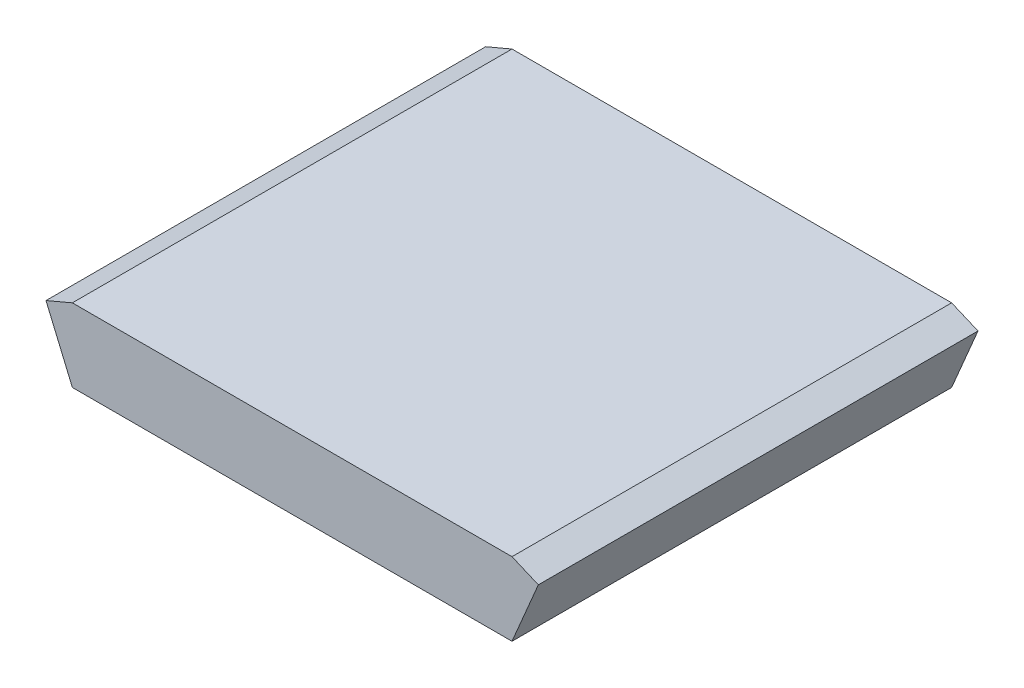
ISO-10303-21;
HEADER;
FILE_DESCRIPTION(('STEP AP214'),'2;1');
FILE_NAME('part.step','',(''),(''),'','','');
FILE_SCHEMA(('AUTOMOTIVE_DESIGN { 1 0 10303 214 1 1 1 1 }'));
ENDSEC;
DATA;
#1=APPLICATION_CONTEXT('core data for automotive mechanical design processes');
#2=APPLICATION_PROTOCOL_DEFINITION('international standard','automotive_design',2000,#1);
#3=PRODUCT_CONTEXT('',#1,'mechanical');
#4=PRODUCT('Part','Part','',(#3));
#5=PRODUCT_RELATED_PRODUCT_CATEGORY('part','',(#4));
#6=PRODUCT_DEFINITION_FORMATION('','',#4);
#7=PRODUCT_DEFINITION_CONTEXT('part definition',#1,'design');
#8=PRODUCT_DEFINITION('design','',#6,#7);
#9=PRODUCT_DEFINITION_SHAPE('','',#8);
#10=(LENGTH_UNIT() NAMED_UNIT(*) SI_UNIT(.MILLI.,.METRE.));
#11=(NAMED_UNIT(*) PLANE_ANGLE_UNIT() SI_UNIT($,.RADIAN.));
#12=(NAMED_UNIT(*) SI_UNIT($,.STERADIAN.) SOLID_ANGLE_UNIT());
#13=UNCERTAINTY_MEASURE_WITH_UNIT(LENGTH_MEASURE(1.E-05),#10,'distance_accuracy_value','');
#14=(GEOMETRIC_REPRESENTATION_CONTEXT(3) GLOBAL_UNCERTAINTY_ASSIGNED_CONTEXT((#13)) GLOBAL_UNIT_ASSIGNED_CONTEXT((#10,
#11,#12)) REPRESENTATION_CONTEXT('',''));
#15=CARTESIAN_POINT('',(0.,0.,0.));
#16=DIRECTION('',(0.,0.,1.));
#17=DIRECTION('',(1.,0.,0.));
#18=AXIS2_PLACEMENT_3D('',#15,#16,#17);
#19=CARTESIAN_POINT('',(-0.318923697198086,0.751337146561365,-1.5));
#20=DIRECTION('',(0.390731128489275,-0.920504853452439,0.));
#21=DIRECTION('',(0.92050485345244,0.390731128489275,0.));
#22=AXIS2_PLACEMENT_3D('',#19,#20,#21);
#23=PLANE('',#22);
#24=DIRECTION('',(0.,0.,1.));
#25=VECTOR('',#24,1.);
#26=CARTESIAN_POINT('',(-1.67983495008466,0.173664592614749,-1.5));
#27=LINE('',#26,#25);
#28=CARTESIAN_POINT('',(-1.67983495008466,0.173664592614749,-1.5));
#29=VERTEX_POINT('',#28);
#30=CARTESIAN_POINT('',(-1.67983495008466,0.173664592614749,1.5));
#31=VERTEX_POINT('',#30);
#32=EDGE_CURVE('E35',#29,#31,#27,.T.);
#33=ORIENTED_EDGE('',*,*,#32,.T.);
#34=DIRECTION('',(0.92050485345244,0.390731128489275,0.));
#35=VECTOR('',#34,1.);
#36=CARTESIAN_POINT('',(-0.318923697198086,0.751337146561365,1.5));
#37=LINE('',#36,#35);
#38=CARTESIAN_POINT('',(-1.5,0.25,1.5));
#39=VERTEX_POINT('',#38);
#40=EDGE_CURVE('E86',#31,#39,#37,.T.);
#41=ORIENTED_EDGE('',*,*,#40,.T.);
#42=DIRECTION('',(0.,0.,1.));
#43=VECTOR('',#42,1.);
#44=CARTESIAN_POINT('',(-1.5,0.25,-1.5));
#45=LINE('',#44,#43);
#46=CARTESIAN_POINT('',(-1.5,0.25,-1.5));
#47=VERTEX_POINT('',#46);
#48=EDGE_CURVE('E11',#47,#39,#45,.T.);
#49=ORIENTED_EDGE('',*,*,#48,.F.);
#50=DIRECTION('',(0.92050485345244,0.390731128489275,0.));
#51=VECTOR('',#50,1.);
#52=CARTESIAN_POINT('',(-0.318923697198086,0.751337146561365,-1.5));
#53=LINE('',#52,#51);
#54=EDGE_CURVE('E88',#29,#47,#53,.T.);
#55=ORIENTED_EDGE('',*,*,#54,.F.);
#56=EDGE_LOOP('',(#33,#41,#49,#55));
#57=FACE_BOUND('',#56,.T.);
#58=ADVANCED_FACE('F32',(#57),#23,.F.);
#59=CARTESIAN_POINT('',(0.,0.25,-1.5));
#60=DIRECTION('',(0.,-1.,0.));
#61=DIRECTION('',(1.,0.,0.));
#62=AXIS2_PLACEMENT_3D('',#59,#60,#61);
#63=PLANE('',#62);
#64=ORIENTED_EDGE('',*,*,#48,.T.);
#65=DIRECTION('',(1.,0.,0.));
#66=VECTOR('',#65,1.);
#67=CARTESIAN_POINT('',(0.,0.25,1.5));
#68=LINE('',#67,#66);
#69=CARTESIAN_POINT('',(1.5,0.25,1.5));
#70=VERTEX_POINT('',#69);
#71=EDGE_CURVE('E100',#39,#70,#68,.T.);
#72=ORIENTED_EDGE('',*,*,#71,.T.);
#73=DIRECTION('',(0.,0.,1.));
#74=VECTOR('',#73,1.);
#75=CARTESIAN_POINT('',(1.5,0.25,-1.5));
#76=LINE('',#75,#74);
#77=CARTESIAN_POINT('',(1.5,0.25,-1.5));
#78=VERTEX_POINT('',#77);
#79=EDGE_CURVE('E40',#78,#70,#76,.T.);
#80=ORIENTED_EDGE('',*,*,#79,.F.);
#81=DIRECTION('',(1.,0.,0.));
#82=VECTOR('',#81,1.);
#83=CARTESIAN_POINT('',(0.,0.25,-1.5));
#84=LINE('',#83,#82);
#85=EDGE_CURVE('E47',#47,#78,#84,.T.);
#86=ORIENTED_EDGE('',*,*,#85,.F.);
#87=EDGE_LOOP('',(#64,#72,#80,#86));
#88=FACE_BOUND('',#87,.T.);
#89=ADVANCED_FACE('F142',(#88),#63,.F.);
#90=CARTESIAN_POINT('',(0.318923697198081,0.751337146561361,-1.5));
#91=DIRECTION('',(0.390731128489272,0.920504853452441,0.));
#92=DIRECTION('',(-0.920504853452441,0.390731128489272,0.));
#93=AXIS2_PLACEMENT_3D('',#90,#91,#92);
#94=PLANE('',#93);
#95=ORIENTED_EDGE('',*,*,#79,.T.);
#96=DIRECTION('',(-0.920504853452441,0.390731128489272,0.));
#97=VECTOR('',#96,1.);
#98=CARTESIAN_POINT('',(0.318923697198081,0.751337146561361,1.5));
#99=LINE('',#98,#97);
#100=CARTESIAN_POINT('',(1.67983495008466,0.173664592614749,1.5));
#101=VERTEX_POINT('',#100);
#102=EDGE_CURVE('E111',#101,#70,#99,.T.);
#103=ORIENTED_EDGE('',*,*,#102,.F.);
#104=DIRECTION('',(0.,0.,1.));
#105=VECTOR('',#104,1.);
#106=CARTESIAN_POINT('',(1.67983495008466,0.173664592614749,-1.5));
#107=LINE('',#106,#105);
#108=CARTESIAN_POINT('',(1.67983495008466,0.173664592614749,-1.5));
#109=VERTEX_POINT('',#108);
#110=EDGE_CURVE('E128',#109,#101,#107,.T.);
#111=ORIENTED_EDGE('',*,*,#110,.F.);
#112=DIRECTION('',(-0.920504853452441,0.390731128489272,0.));
#113=VECTOR('',#112,1.);
#114=CARTESIAN_POINT('',(0.318923697198081,0.751337146561361,-1.5));
#115=LINE('',#114,#113);
#116=EDGE_CURVE('E123',#109,#78,#115,.T.);
#117=ORIENTED_EDGE('',*,*,#116,.T.);
#118=EDGE_LOOP('',(#95,#103,#111,#117));
#119=FACE_BOUND('',#118,.T.);
#120=ADVANCED_FACE('F140',(#119),#94,.T.);
#121=CARTESIAN_POINT('',(1.36091125288658,-0.577672553946618,-1.5));
#122=DIRECTION('',(0.920504853452439,-0.390731128489277,0.));
#123=DIRECTION('',(0.390731128489277,0.920504853452439,0.));
#124=AXIS2_PLACEMENT_3D('',#121,#122,#123);
#125=PLANE('',#124);
#126=ORIENTED_EDGE('',*,*,#110,.T.);
#127=DIRECTION('',(0.390731128489277,0.920504853452439,0.));
#128=VECTOR('',#127,1.);
#129=CARTESIAN_POINT('',(1.36091125288658,-0.577672553946618,1.5));
#130=LINE('',#129,#128);
#131=CARTESIAN_POINT('',(1.5,-0.249999999999999,1.5));
#132=VERTEX_POINT('',#131);
#133=EDGE_CURVE('E106',#132,#101,#130,.T.);
#134=ORIENTED_EDGE('',*,*,#133,.F.);
#135=DIRECTION('',(0.,0.,1.));
#136=VECTOR('',#135,1.);
#137=CARTESIAN_POINT('',(1.5,-0.249999999999999,-1.5));
#138=LINE('',#137,#136);
#139=CARTESIAN_POINT('',(1.5,-0.249999999999999,-1.5));
#140=VERTEX_POINT('',#139);
#141=EDGE_CURVE('E130',#140,#132,#138,.T.);
#142=ORIENTED_EDGE('',*,*,#141,.F.);
#143=DIRECTION('',(0.390731128489277,0.920504853452439,0.));
#144=VECTOR('',#143,1.);
#145=CARTESIAN_POINT('',(1.36091125288658,-0.577672553946618,-1.5));
#146=LINE('',#145,#144);
#147=EDGE_CURVE('E120',#140,#109,#146,.T.);
#148=ORIENTED_EDGE('',*,*,#147,.T.);
#149=EDGE_LOOP('',(#126,#134,#142,#148));
#150=FACE_BOUND('',#149,.T.);
#151=ADVANCED_FACE('F138',(#150),#125,.T.);
#152=CARTESIAN_POINT('',(0.,-0.25,-1.5));
#153=DIRECTION('',(0.,-1.,0.));
#154=DIRECTION('',(1.,0.,0.));
#155=AXIS2_PLACEMENT_3D('',#152,#153,#154);
#156=PLANE('',#155);
#157=ORIENTED_EDGE('',*,*,#141,.T.);
#158=DIRECTION('',(1.,0.,0.));
#159=VECTOR('',#158,1.);
#160=CARTESIAN_POINT('',(0.,-0.25,1.5));
#161=LINE('',#160,#159);
#162=CARTESIAN_POINT('',(-1.5,-0.25,1.5));
#163=VERTEX_POINT('',#162);
#164=EDGE_CURVE('E104',#163,#132,#161,.T.);
#165=ORIENTED_EDGE('',*,*,#164,.F.);
#166=DIRECTION('',(0.,0.,1.));
#167=VECTOR('',#166,1.);
#168=CARTESIAN_POINT('',(-1.5,-0.25,-1.5));
#169=LINE('',#168,#167);
#170=CARTESIAN_POINT('',(-1.5,-0.25,-1.5));
#171=VERTEX_POINT('',#170);
#172=EDGE_CURVE('E92',#171,#163,#169,.T.);
#173=ORIENTED_EDGE('',*,*,#172,.F.);
#174=DIRECTION('',(1.,0.,0.));
#175=VECTOR('',#174,1.);
#176=CARTESIAN_POINT('',(0.,-0.25,-1.5));
#177=LINE('',#176,#175);
#178=EDGE_CURVE('E117',#171,#140,#177,.T.);
#179=ORIENTED_EDGE('',*,*,#178,.T.);
#180=EDGE_LOOP('',(#157,#165,#173,#179));
#181=FACE_BOUND('',#180,.T.);
#182=ADVANCED_FACE('F132',(#181),#156,.T.);
#183=CARTESIAN_POINT('',(-1.36091125288658,-0.577672553946619,-1.5));
#184=DIRECTION('',(0.920504853452439,0.390731128489278,0.));
#185=DIRECTION('',(-0.390731128489278,0.920504853452439,0.));
#186=AXIS2_PLACEMENT_3D('',#183,#184,#185);
#187=PLANE('',#186);
#188=ORIENTED_EDGE('',*,*,#172,.T.);
#189=DIRECTION('',(-0.390731128489278,0.920504853452439,0.));
#190=VECTOR('',#189,1.);
#191=CARTESIAN_POINT('',(-1.36091125288658,-0.577672553946619,1.5));
#192=LINE('',#191,#190);
#193=EDGE_CURVE('E97',#163,#31,#192,.T.);
#194=ORIENTED_EDGE('',*,*,#193,.T.);
#195=ORIENTED_EDGE('',*,*,#32,.F.);
#196=DIRECTION('',(-0.390731128489278,0.920504853452439,0.));
#197=VECTOR('',#196,1.);
#198=CARTESIAN_POINT('',(-1.36091125288658,-0.577672553946619,-1.5));
#199=LINE('',#198,#197);
#200=EDGE_CURVE('E115',#171,#29,#199,.T.);
#201=ORIENTED_EDGE('',*,*,#200,.F.);
#202=EDGE_LOOP('',(#188,#194,#195,#201));
#203=FACE_BOUND('',#202,.T.);
#204=ADVANCED_FACE('F102',(#203),#187,.F.);
#205=CARTESIAN_POINT('',(0.,0.,-1.5));
#206=DIRECTION('',(0.,0.,1.));
#207=DIRECTION('',(1.,0.,0.));
#208=AXIS2_PLACEMENT_3D('',#205,#206,#207);
#209=PLANE('',#208);
#210=ORIENTED_EDGE('',*,*,#54,.T.);
#211=ORIENTED_EDGE('',*,*,#85,.T.);
#212=ORIENTED_EDGE('',*,*,#116,.F.);
#213=ORIENTED_EDGE('',*,*,#147,.F.);
#214=ORIENTED_EDGE('',*,*,#178,.F.);
#215=ORIENTED_EDGE('',*,*,#200,.T.);
#216=EDGE_LOOP('',(#210,#211,#212,#213,#214,#215));
#217=FACE_BOUND('',#216,.T.);
#218=ADVANCED_FACE('F141',(#217),#209,.F.);
#219=CARTESIAN_POINT('',(0.,0.,1.5));
#220=DIRECTION('',(0.,0.,1.));
#221=DIRECTION('',(1.,0.,0.));
#222=AXIS2_PLACEMENT_3D('',#219,#220,#221);
#223=PLANE('',#222);
#224=ORIENTED_EDGE('',*,*,#40,.F.);
#225=ORIENTED_EDGE('',*,*,#193,.F.);
#226=ORIENTED_EDGE('',*,*,#164,.T.);
#227=ORIENTED_EDGE('',*,*,#133,.T.);
#228=ORIENTED_EDGE('',*,*,#102,.T.);
#229=ORIENTED_EDGE('',*,*,#71,.F.);
#230=EDGE_LOOP('',(#224,#225,#226,#227,#228,#229));
#231=FACE_BOUND('',#230,.T.);
#232=ADVANCED_FACE('F95',(#231),#223,.T.);
#233=CLOSED_SHELL('',(#58,#89,#120,#151,#182,#204,#218,#232));
#234=MANIFOLD_SOLID_BREP('B2',#233);
#235=ADVANCED_BREP_SHAPE_REPRESENTATION('',(#18,#234),#14);
#236=SHAPE_DEFINITION_REPRESENTATION(#9,#235);
ENDSEC;
END-ISO-10303-21;
